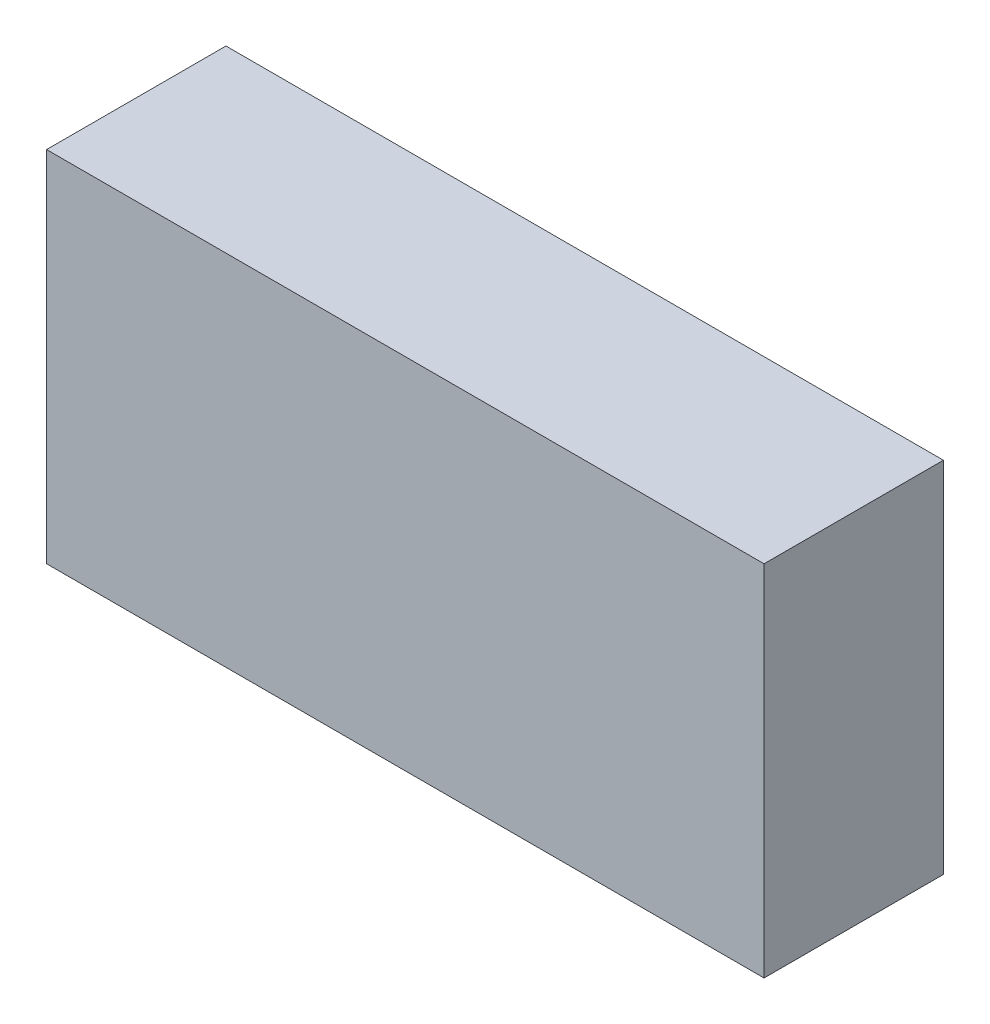
ISO-10303-21;
HEADER;
FILE_DESCRIPTION(('STEP AP214'),'2;1');
FILE_NAME('part.step','',(''),(''),'','','');
FILE_SCHEMA(('AUTOMOTIVE_DESIGN { 1 0 10303 214 1 1 1 1 }'));
ENDSEC;
DATA;
#1=APPLICATION_CONTEXT('core data for automotive mechanical design processes');
#2=APPLICATION_PROTOCOL_DEFINITION('international standard','automotive_design',2000,#1);
#3=PRODUCT_CONTEXT('',#1,'mechanical');
#4=PRODUCT('Part','Part','',(#3));
#5=PRODUCT_RELATED_PRODUCT_CATEGORY('part','',(#4));
#6=PRODUCT_DEFINITION_FORMATION('','',#4);
#7=PRODUCT_DEFINITION_CONTEXT('part definition',#1,'design');
#8=PRODUCT_DEFINITION('design','',#6,#7);
#9=PRODUCT_DEFINITION_SHAPE('','',#8);
#10=(LENGTH_UNIT() NAMED_UNIT(*) SI_UNIT(.MILLI.,.METRE.));
#11=(NAMED_UNIT(*) PLANE_ANGLE_UNIT() SI_UNIT($,.RADIAN.));
#12=(NAMED_UNIT(*) SI_UNIT($,.STERADIAN.) SOLID_ANGLE_UNIT());
#13=UNCERTAINTY_MEASURE_WITH_UNIT(LENGTH_MEASURE(1.E-05),#10,'distance_accuracy_value','');
#14=(GEOMETRIC_REPRESENTATION_CONTEXT(3) GLOBAL_UNCERTAINTY_ASSIGNED_CONTEXT((#13)) GLOBAL_UNIT_ASSIGNED_CONTEXT((#10,
#11,#12)) REPRESENTATION_CONTEXT('',''));
#15=CARTESIAN_POINT('',(0.,0.,0.));
#16=DIRECTION('',(0.,0.,1.));
#17=DIRECTION('',(1.,0.,0.));
#18=AXIS2_PLACEMENT_3D('',#15,#16,#17);
#19=CARTESIAN_POINT('',(-20.,10.,10.));
#20=DIRECTION('',(1.,0.,0.));
#21=DIRECTION('',(0.,0.,-1.));
#22=AXIS2_PLACEMENT_3D('',#19,#20,#21);
#23=PLANE('',#22);
#24=DIRECTION('',(0.,-1.,0.));
#25=VECTOR('',#24,1.);
#26=CARTESIAN_POINT('',(-20.,10.,0.));
#27=LINE('',#26,#25);
#28=CARTESIAN_POINT('',(-20.,10.,0.));
#29=VERTEX_POINT('',#28);
#30=CARTESIAN_POINT('',(-20.,-10.,0.));
#31=VERTEX_POINT('',#30);
#32=EDGE_CURVE('E105',#29,#31,#27,.T.);
#33=ORIENTED_EDGE('',*,*,#32,.T.);
#34=DIRECTION('',(0.,0.,-1.));
#35=VECTOR('',#34,1.);
#36=CARTESIAN_POINT('',(-20.,-10.,10.));
#37=LINE('',#36,#35);
#38=CARTESIAN_POINT('',(-20.,-10.,10.));
#39=VERTEX_POINT('',#38);
#40=EDGE_CURVE('E11',#39,#31,#37,.T.);
#41=ORIENTED_EDGE('',*,*,#40,.F.);
#42=DIRECTION('',(0.,-1.,0.));
#43=VECTOR('',#42,1.);
#44=CARTESIAN_POINT('',(-20.,10.,10.));
#45=LINE('',#44,#43);
#46=CARTESIAN_POINT('',(-20.,10.,10.));
#47=VERTEX_POINT('',#46);
#48=EDGE_CURVE('E89',#47,#39,#45,.T.);
#49=ORIENTED_EDGE('',*,*,#48,.F.);
#50=DIRECTION('',(0.,0.,-1.));
#51=VECTOR('',#50,1.);
#52=CARTESIAN_POINT('',(-20.,10.,10.));
#53=LINE('',#52,#51);
#54=EDGE_CURVE('E98',#47,#29,#53,.T.);
#55=ORIENTED_EDGE('',*,*,#54,.T.);
#56=EDGE_LOOP('',(#33,#41,#49,#55));
#57=FACE_BOUND('',#56,.T.);
#58=ADVANCED_FACE('F39',(#57),#23,.F.);
#59=CARTESIAN_POINT('',(-20.,-10.,10.));
#60=DIRECTION('',(0.,1.,0.));
#61=DIRECTION('',(0.,0.,1.));
#62=AXIS2_PLACEMENT_3D('',#59,#60,#61);
#63=PLANE('',#62);
#64=DIRECTION('',(1.,0.,0.));
#65=VECTOR('',#64,1.);
#66=CARTESIAN_POINT('',(-20.,-10.,0.));
#67=LINE('',#66,#65);
#68=CARTESIAN_POINT('',(20.,-10.,0.));
#69=VERTEX_POINT('',#68);
#70=EDGE_CURVE('E94',#31,#69,#67,.T.);
#71=ORIENTED_EDGE('',*,*,#70,.T.);
#72=DIRECTION('',(0.,0.,-1.));
#73=VECTOR('',#72,1.);
#74=CARTESIAN_POINT('',(20.,-10.,10.));
#75=LINE('',#74,#73);
#76=CARTESIAN_POINT('',(20.,-10.,10.));
#77=VERTEX_POINT('',#76);
#78=EDGE_CURVE('E50',#77,#69,#75,.T.);
#79=ORIENTED_EDGE('',*,*,#78,.F.);
#80=DIRECTION('',(1.,0.,0.));
#81=VECTOR('',#80,1.);
#82=CARTESIAN_POINT('',(-20.,-10.,10.));
#83=LINE('',#82,#81);
#84=EDGE_CURVE('E85',#39,#77,#83,.T.);
#85=ORIENTED_EDGE('',*,*,#84,.F.);
#86=ORIENTED_EDGE('',*,*,#40,.T.);
#87=EDGE_LOOP('',(#71,#79,#85,#86));
#88=FACE_BOUND('',#87,.T.);
#89=ADVANCED_FACE('F91',(#88),#63,.F.);
#90=CARTESIAN_POINT('',(20.,-10.,10.));
#91=DIRECTION('',(-1.,0.,0.));
#92=DIRECTION('',(0.,0.,1.));
#93=AXIS2_PLACEMENT_3D('',#90,#91,#92);
#94=PLANE('',#93);
#95=DIRECTION('',(0.,1.,0.));
#96=VECTOR('',#95,1.);
#97=CARTESIAN_POINT('',(20.,-10.,0.));
#98=LINE('',#97,#96);
#99=CARTESIAN_POINT('',(20.,10.,0.));
#100=VERTEX_POINT('',#99);
#101=EDGE_CURVE('E75',#69,#100,#98,.T.);
#102=ORIENTED_EDGE('',*,*,#101,.T.);
#103=DIRECTION('',(0.,0.,-1.));
#104=VECTOR('',#103,1.);
#105=CARTESIAN_POINT('',(20.,10.,10.));
#106=LINE('',#105,#104);
#107=CARTESIAN_POINT('',(20.,10.,10.));
#108=VERTEX_POINT('',#107);
#109=EDGE_CURVE('E92',#108,#100,#106,.T.);
#110=ORIENTED_EDGE('',*,*,#109,.F.);
#111=DIRECTION('',(0.,1.,0.));
#112=VECTOR('',#111,1.);
#113=CARTESIAN_POINT('',(20.,-10.,10.));
#114=LINE('',#113,#112);
#115=EDGE_CURVE('E86',#77,#108,#114,.T.);
#116=ORIENTED_EDGE('',*,*,#115,.F.);
#117=ORIENTED_EDGE('',*,*,#78,.T.);
#118=EDGE_LOOP('',(#102,#110,#116,#117));
#119=FACE_BOUND('',#118,.T.);
#120=ADVANCED_FACE('F96',(#119),#94,.F.);
#121=CARTESIAN_POINT('',(20.,10.,10.));
#122=DIRECTION('',(0.,-1.,0.));
#123=DIRECTION('',(0.,0.,-1.));
#124=AXIS2_PLACEMENT_3D('',#121,#122,#123);
#125=PLANE('',#124);
#126=DIRECTION('',(-1.,0.,0.));
#127=VECTOR('',#126,1.);
#128=CARTESIAN_POINT('',(20.,10.,0.));
#129=LINE('',#128,#127);
#130=EDGE_CURVE('E80',#100,#29,#129,.T.);
#131=ORIENTED_EDGE('',*,*,#130,.T.);
#132=ORIENTED_EDGE('',*,*,#54,.F.);
#133=DIRECTION('',(-1.,0.,0.));
#134=VECTOR('',#133,1.);
#135=CARTESIAN_POINT('',(20.,10.,10.));
#136=LINE('',#135,#134);
#137=EDGE_CURVE('E54',#108,#47,#136,.T.);
#138=ORIENTED_EDGE('',*,*,#137,.F.);
#139=ORIENTED_EDGE('',*,*,#109,.T.);
#140=EDGE_LOOP('',(#131,#132,#138,#139));
#141=FACE_BOUND('',#140,.T.);
#142=ADVANCED_FACE('F108',(#141),#125,.F.);
#143=CARTESIAN_POINT('',(0.,0.,10.));
#144=DIRECTION('',(0.,0.,1.));
#145=DIRECTION('',(1.,0.,0.));
#146=AXIS2_PLACEMENT_3D('',#143,#144,#145);
#147=PLANE('',#146);
#148=ORIENTED_EDGE('',*,*,#48,.T.);
#149=ORIENTED_EDGE('',*,*,#84,.T.);
#150=ORIENTED_EDGE('',*,*,#115,.T.);
#151=ORIENTED_EDGE('',*,*,#137,.T.);
#152=EDGE_LOOP('',(#148,#149,#150,#151));
#153=FACE_BOUND('',#152,.T.);
#154=ADVANCED_FACE('F88',(#153),#147,.T.);
#155=CARTESIAN_POINT('',(0.,0.,0.));
#156=DIRECTION('',(0.,0.,1.));
#157=DIRECTION('',(1.,0.,0.));
#158=AXIS2_PLACEMENT_3D('',#155,#156,#157);
#159=PLANE('',#158);
#160=ORIENTED_EDGE('',*,*,#32,.F.);
#161=ORIENTED_EDGE('',*,*,#130,.F.);
#162=ORIENTED_EDGE('',*,*,#101,.F.);
#163=ORIENTED_EDGE('',*,*,#70,.F.);
#164=EDGE_LOOP('',(#160,#161,#162,#163));
#165=FACE_BOUND('',#164,.T.);
#166=ADVANCED_FACE('F115',(#165),#159,.F.);
#167=CLOSED_SHELL('',(#58,#89,#120,#142,#154,#166));
#168=MANIFOLD_SOLID_BREP('B2',#167);
#169=ADVANCED_BREP_SHAPE_REPRESENTATION('',(#18,#168),#14);
#170=SHAPE_DEFINITION_REPRESENTATION(#9,#169);
ENDSEC;
END-ISO-10303-21;
